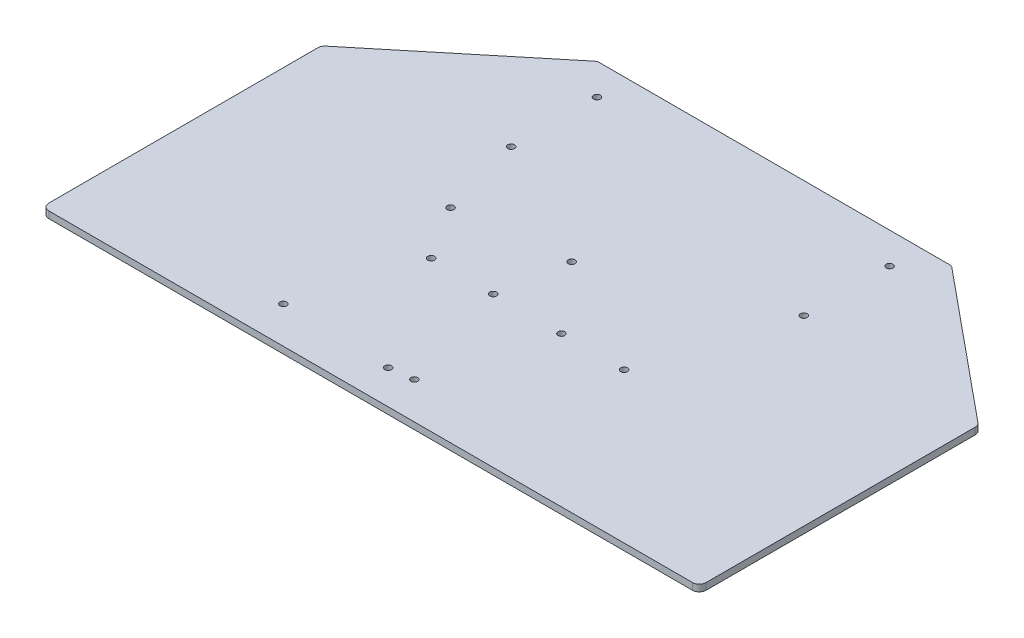
ISO-10303-21;
HEADER;
FILE_DESCRIPTION(('STEP AP214'),'2;1');
FILE_NAME('part.step','',(''),(''),'','','');
FILE_SCHEMA(('AUTOMOTIVE_DESIGN { 1 0 10303 214 1 1 1 1 }'));
ENDSEC;
DATA;
#1=APPLICATION_CONTEXT('core data for automotive mechanical design processes');
#2=APPLICATION_PROTOCOL_DEFINITION('international standard','automotive_design',2000,#1);
#3=PRODUCT_CONTEXT('',#1,'mechanical');
#4=PRODUCT('Part','Part','',(#3));
#5=PRODUCT_RELATED_PRODUCT_CATEGORY('part','',(#4));
#6=PRODUCT_DEFINITION_FORMATION('','',#4);
#7=PRODUCT_DEFINITION_CONTEXT('part definition',#1,'design');
#8=PRODUCT_DEFINITION('design','',#6,#7);
#9=PRODUCT_DEFINITION_SHAPE('','',#8);
#10=(LENGTH_UNIT() NAMED_UNIT(*) SI_UNIT(.MILLI.,.METRE.));
#11=(NAMED_UNIT(*) PLANE_ANGLE_UNIT() SI_UNIT($,.RADIAN.));
#12=(NAMED_UNIT(*) SI_UNIT($,.STERADIAN.) SOLID_ANGLE_UNIT());
#13=UNCERTAINTY_MEASURE_WITH_UNIT(LENGTH_MEASURE(1.E-05),#10,'distance_accuracy_value','');
#14=(GEOMETRIC_REPRESENTATION_CONTEXT(3) GLOBAL_UNCERTAINTY_ASSIGNED_CONTEXT((#13)) GLOBAL_UNIT_ASSIGNED_CONTEXT((#10,
#11,#12)) REPRESENTATION_CONTEXT('',''));
#15=CARTESIAN_POINT('',(0.,0.,0.));
#16=DIRECTION('',(0.,0.,1.));
#17=DIRECTION('',(1.,0.,0.));
#18=AXIS2_PLACEMENT_3D('',#15,#16,#17);
#19=CARTESIAN_POINT('',(0.,3.,0.));
#20=DIRECTION('',(0.,-1.,0.));
#21=DIRECTION('',(0.,0.,-1.));
#22=AXIS2_PLACEMENT_3D('',#19,#20,#21);
#23=PLANE('',#22);
#24=CARTESIAN_POINT('',(151.6,3.,-18.4000000000124));
#25=DIRECTION('',(0.,1.,0.));
#26=DIRECTION('',(0.,0.,1.));
#27=AXIS2_PLACEMENT_3D('',#24,#25,#26);
#28=CIRCLE('',#27,1.49999999999638);
#29=CARTESIAN_POINT('',(151.6,3.,-16.900000000016));
#30=VERTEX_POINT('',#29);
#31=EDGE_CURVE('E247',#30,#30,#28,.T.);
#32=ORIENTED_EDGE('',*,*,#31,.F.);
#33=EDGE_LOOP('',(#32));
#34=FACE_BOUND('',#33,.T.);
#35=CARTESIAN_POINT('',(194.6,3.,-68.9000000000124));
#36=DIRECTION('',(0.,1.,0.));
#37=DIRECTION('',(0.,0.,1.));
#38=AXIS2_PLACEMENT_3D('',#35,#36,#37);
#39=CIRCLE('',#38,1.49999999999637);
#40=CARTESIAN_POINT('',(194.6,3.,-67.400000000016));
#41=VERTEX_POINT('',#40);
#42=EDGE_CURVE('E253',#41,#41,#39,.T.);
#43=ORIENTED_EDGE('',*,*,#42,.F.);
#44=EDGE_LOOP('',(#43));
#45=FACE_BOUND('',#44,.T.);
#46=CARTESIAN_POINT('',(83.275,3.,-129.849046066715));
#47=DIRECTION('',(0.,1.,0.));
#48=DIRECTION('',(0.,0.,1.));
#49=AXIS2_PLACEMENT_3D('',#46,#47,#48);
#50=CIRCLE('',#49,1.5);
#51=CARTESIAN_POINT('',(83.275,3.,-128.349046066715));
#52=VERTEX_POINT('',#51);
#53=EDGE_CURVE('E234',#52,#52,#50,.T.);
#54=ORIENTED_EDGE('',*,*,#53,.F.);
#55=EDGE_LOOP('',(#54));
#56=FACE_BOUND('',#55,.T.);
#57=CARTESIAN_POINT('',(213.725,3.,-168.099046066715));
#58=DIRECTION('',(0.,1.,0.));
#59=DIRECTION('',(0.,0.,1.));
#60=AXIS2_PLACEMENT_3D('',#57,#58,#59);
#61=CIRCLE('',#60,1.5);
#62=CARTESIAN_POINT('',(213.725,3.,-166.599046066715));
#63=VERTEX_POINT('',#62);
#64=EDGE_CURVE('E207',#63,#63,#61,.T.);
#65=ORIENTED_EDGE('',*,*,#64,.F.);
#66=EDGE_LOOP('',(#65));
#67=FACE_BOUND('',#66,.T.);
#68=CARTESIAN_POINT('',(93.2999999999997,3.,-92.8000000000124));
#69=DIRECTION('',(0.,1.,0.));
#70=DIRECTION('',(0.,0.,1.));
#71=AXIS2_PLACEMENT_3D('',#68,#69,#70);
#72=CIRCLE('',#71,1.49999999999637);
#73=CARTESIAN_POINT('',(93.2999999999997,3.,-91.300000000016));
#74=VERTEX_POINT('',#73);
#75=EDGE_CURVE('E40',#74,#74,#72,.T.);
#76=ORIENTED_EDGE('',*,*,#75,.F.);
#77=EDGE_LOOP('',(#76));
#78=FACE_BOUND('',#77,.T.);
#79=CARTESIAN_POINT('',(141.2,3.,-17.1000000000124));
#80=DIRECTION('',(0.,1.,0.));
#81=DIRECTION('',(0.,0.,1.));
#82=AXIS2_PLACEMENT_3D('',#79,#80,#81);
#83=CIRCLE('',#82,1.49999999999638);
#84=CARTESIAN_POINT('',(141.2,3.,-15.600000000016));
#85=VERTEX_POINT('',#84);
#86=EDGE_CURVE('E264',#85,#85,#83,.T.);
#87=ORIENTED_EDGE('',*,*,#86,.F.);
#88=EDGE_LOOP('',(#87));
#89=FACE_BOUND('',#88,.T.);
#90=CARTESIAN_POINT('',(93.1999999999997,3.,-18.3500000000124));
#91=DIRECTION('',(0.,1.,0.));
#92=DIRECTION('',(0.,0.,1.));
#93=AXIS2_PLACEMENT_3D('',#90,#91,#92);
#94=CIRCLE('',#93,1.49999999999638);
#95=CARTESIAN_POINT('',(93.1999999999997,3.,-16.850000000016));
#96=VERTEX_POINT('',#95);
#97=EDGE_CURVE('E265',#96,#96,#94,.T.);
#98=ORIENTED_EDGE('',*,*,#97,.F.);
#99=EDGE_LOOP('',(#98));
#100=FACE_BOUND('',#99,.T.);
#101=CARTESIAN_POINT('',(166.65,3.,-68.9000000000124));
#102=DIRECTION('',(0.,1.,0.));
#103=DIRECTION('',(0.,0.,1.));
#104=AXIS2_PLACEMENT_3D('',#101,#102,#103);
#105=CIRCLE('',#104,1.49999999999637);
#106=CARTESIAN_POINT('',(166.65,3.,-67.400000000016));
#107=VERTEX_POINT('',#106);
#108=EDGE_CURVE('E246',#107,#107,#105,.T.);
#109=ORIENTED_EDGE('',*,*,#108,.F.);
#110=EDGE_LOOP('',(#109));
#111=FACE_BOUND('',#110,.T.);
#112=CARTESIAN_POINT('',(108.5,3.,-68.9500000000124));
#113=DIRECTION('',(0.,1.,0.));
#114=DIRECTION('',(0.,0.,1.));
#115=AXIS2_PLACEMENT_3D('',#112,#113,#114);
#116=CIRCLE('',#115,1.49999999999637);
#117=CARTESIAN_POINT('',(108.5,3.,-67.450000000016));
#118=VERTEX_POINT('',#117);
#119=EDGE_CURVE('E276',#118,#118,#116,.T.);
#120=ORIENTED_EDGE('',*,*,#119,.F.);
#121=EDGE_LOOP('',(#120));
#122=FACE_BOUND('',#121,.T.);
#123=CARTESIAN_POINT('',(136.2,3.,-68.9500000000124));
#124=DIRECTION('',(0.,1.,0.));
#125=DIRECTION('',(0.,0.,1.));
#126=AXIS2_PLACEMENT_3D('',#123,#124,#125);
#127=CIRCLE('',#126,1.49999999999637);
#128=CARTESIAN_POINT('',(136.2,3.,-67.450000000016));
#129=VERTEX_POINT('',#128);
#130=EDGE_CURVE('E288',#129,#129,#127,.T.);
#131=ORIENTED_EDGE('',*,*,#130,.F.);
#132=EDGE_LOOP('',(#131));
#133=FACE_BOUND('',#132,.T.);
#134=CARTESIAN_POINT('',(141.2,3.,-98.9000000000124));
#135=DIRECTION('',(0.,1.,0.));
#136=DIRECTION('',(0.,0.,1.));
#137=AXIS2_PLACEMENT_3D('',#134,#135,#136);
#138=CIRCLE('',#137,1.49999999999637);
#139=CARTESIAN_POINT('',(141.2,3.,-97.400000000016));
#140=VERTEX_POINT('',#139);
#141=EDGE_CURVE('E282',#140,#140,#138,.T.);
#142=ORIENTED_EDGE('',*,*,#141,.F.);
#143=EDGE_LOOP('',(#142));
#144=FACE_BOUND('',#143,.T.);
#145=CARTESIAN_POINT('',(213.725,3.,-129.849046066715));
#146=DIRECTION('',(0.,1.,0.));
#147=DIRECTION('',(0.,0.,1.));
#148=AXIS2_PLACEMENT_3D('',#145,#146,#147);
#149=CIRCLE('',#148,1.5);
#150=CARTESIAN_POINT('',(213.725,3.,-128.349046066715));
#151=VERTEX_POINT('',#150);
#152=EDGE_CURVE('E235',#151,#151,#149,.T.);
#153=ORIENTED_EDGE('',*,*,#152,.F.);
#154=EDGE_LOOP('',(#153));
#155=FACE_BOUND('',#154,.T.);
#156=CARTESIAN_POINT('',(83.275,3.,-168.099046066715));
#157=DIRECTION('',(0.,1.,0.));
#158=DIRECTION('',(0.,0.,1.));
#159=AXIS2_PLACEMENT_3D('',#156,#157,#158);
#160=CIRCLE('',#159,1.5);
#161=CARTESIAN_POINT('',(83.275,3.,-166.599046066715));
#162=VERTEX_POINT('',#161);
#163=EDGE_CURVE('E228',#162,#162,#160,.T.);
#164=ORIENTED_EDGE('',*,*,#163,.F.);
#165=EDGE_LOOP('',(#164));
#166=FACE_BOUND('',#165,.T.);
#167=CARTESIAN_POINT('',(5.,3.,-5.));
#168=DIRECTION('',(0.,1.,0.));
#169=DIRECTION('',(0.,0.,1.));
#170=AXIS2_PLACEMENT_3D('',#167,#168,#169);
#171=CIRCLE('',#170,3.);
#172=CARTESIAN_POINT('',(2.,3.,-5.));
#173=VERTEX_POINT('',#172);
#174=CARTESIAN_POINT('',(5.,3.,-2.));
#175=VERTEX_POINT('',#174);
#176=EDGE_CURVE('E173',#173,#175,#171,.T.);
#177=ORIENTED_EDGE('',*,*,#176,.T.);
#178=DIRECTION('',(1.,0.,0.));
#179=VECTOR('',#178,1.);
#180=CARTESIAN_POINT('',(5.,3.,-2.));
#181=LINE('',#180,#179);
#182=CARTESIAN_POINT('',(292.,3.,-2.));
#183=VERTEX_POINT('',#182);
#184=EDGE_CURVE('E176',#175,#183,#181,.T.);
#185=ORIENTED_EDGE('',*,*,#184,.T.);
#186=CARTESIAN_POINT('',(292.,3.,-5.));
#187=DIRECTION('',(0.,1.,0.));
#188=DIRECTION('',(0.,0.,1.));
#189=AXIS2_PLACEMENT_3D('',#186,#187,#188);
#190=CIRCLE('',#189,2.99999999999997);
#191=CARTESIAN_POINT('',(295.,3.,-5.));
#192=VERTEX_POINT('',#191);
#193=EDGE_CURVE('E51',#183,#192,#190,.T.);
#194=ORIENTED_EDGE('',*,*,#193,.T.);
#195=DIRECTION('',(0.,0.,-1.));
#196=VECTOR('',#195,1.);
#197=CARTESIAN_POINT('',(295.,3.,-5.));
#198=LINE('',#197,#196);
#199=CARTESIAN_POINT('',(295.,3.,-125.));
#200=VERTEX_POINT('',#199);
#201=EDGE_CURVE('E132',#192,#200,#198,.T.);
#202=ORIENTED_EDGE('',*,*,#201,.T.);
#203=CARTESIAN_POINT('',(292.,3.,-125.));
#204=DIRECTION('',(0.,1.,0.));
#205=DIRECTION('',(0.,0.,-1.));
#206=AXIS2_PLACEMENT_3D('',#203,#204,#205);
#207=CIRCLE('',#206,3.);
#208=CARTESIAN_POINT('',(293.906404455119,3.,-127.316381240966));
#209=VERTEX_POINT('',#208);
#210=EDGE_CURVE('E181',#200,#209,#207,.T.);
#211=ORIENTED_EDGE('',*,*,#210,.T.);
#212=DIRECTION('',(-0.772127080322098,0.,-0.635468151706497));
#213=VECTOR('',#212,1.);
#214=CARTESIAN_POINT('',(293.906404455119,3.,-127.316381240966));
#215=LINE('',#214,#213);
#216=CARTESIAN_POINT('',(228.293576769853,3.,-181.316381240966));
#217=VERTEX_POINT('',#216);
#218=EDGE_CURVE('E184',#209,#217,#215,.T.);
#219=ORIENTED_EDGE('',*,*,#218,.T.);
#220=CARTESIAN_POINT('',(226.387172314733,3.,-179.));
#221=DIRECTION('',(0.,1.,0.));
#222=DIRECTION('',(0.,0.,-1.));
#223=AXIS2_PLACEMENT_3D('',#220,#221,#222);
#224=CIRCLE('',#223,3.00000000000001);
#225=CARTESIAN_POINT('',(226.387172314733,3.,-182.));
#226=VERTEX_POINT('',#225);
#227=EDGE_CURVE('E187',#217,#226,#224,.T.);
#228=ORIENTED_EDGE('',*,*,#227,.T.);
#229=DIRECTION('',(-1.,0.,0.));
#230=VECTOR('',#229,1.);
#231=CARTESIAN_POINT('',(70.6128276852667,3.,-182.));
#232=LINE('',#231,#230);
#233=CARTESIAN_POINT('',(70.6128276852667,3.,-182.));
#234=VERTEX_POINT('',#233);
#235=EDGE_CURVE('E190',#226,#234,#232,.T.);
#236=ORIENTED_EDGE('',*,*,#235,.T.);
#237=CARTESIAN_POINT('',(70.6128276852667,3.,-179.));
#238=DIRECTION('',(0.,1.,0.));
#239=DIRECTION('',(0.,0.,1.));
#240=AXIS2_PLACEMENT_3D('',#237,#238,#239);
#241=CIRCLE('',#240,3.00000000000001);
#242=CARTESIAN_POINT('',(68.7064232301472,3.,-181.316381240966));
#243=VERTEX_POINT('',#242);
#244=EDGE_CURVE('E193',#234,#243,#241,.T.);
#245=ORIENTED_EDGE('',*,*,#244,.T.);
#246=DIRECTION('',(-0.772127080322098,0.,0.635468151706497));
#247=VECTOR('',#246,1.);
#248=CARTESIAN_POINT('',(3.0935955448805,3.,-127.316381240966));
#249=LINE('',#248,#247);
#250=CARTESIAN_POINT('',(3.0935955448805,3.,-127.316381240966));
#251=VERTEX_POINT('',#250);
#252=EDGE_CURVE('E196',#243,#251,#249,.T.);
#253=ORIENTED_EDGE('',*,*,#252,.T.);
#254=CARTESIAN_POINT('',(5.,3.,-125.));
#255=DIRECTION('',(0.,1.,0.));
#256=DIRECTION('',(0.,0.,1.));
#257=AXIS2_PLACEMENT_3D('',#254,#255,#256);
#258=CIRCLE('',#257,3.00000000000001);
#259=CARTESIAN_POINT('',(1.99999999999999,3.,-125.));
#260=VERTEX_POINT('',#259);
#261=EDGE_CURVE('E199',#251,#260,#258,.T.);
#262=ORIENTED_EDGE('',*,*,#261,.T.);
#263=DIRECTION('',(0.,0.,1.));
#264=VECTOR('',#263,1.);
#265=CARTESIAN_POINT('',(2.,3.,-5.));
#266=LINE('',#265,#264);
#267=EDGE_CURVE('E202',#260,#173,#266,.T.);
#268=ORIENTED_EDGE('',*,*,#267,.T.);
#269=EDGE_LOOP('',(#177,#185,#194,#202,#211,#219,#228,#236,#245,#253,#262,#268));
#270=FACE_BOUND('',#269,.T.);
#271=ADVANCED_FACE('F36',(#34,#45,#56,#67,#78,#89,#100,#111,#122,#133,#144,#155,#166,#270),#23,.F.);
#272=CARTESIAN_POINT('',(0.,0.,0.));
#273=DIRECTION('',(0.,-1.,0.));
#274=DIRECTION('',(0.,0.,-1.));
#275=AXIS2_PLACEMENT_3D('',#272,#273,#274);
#276=PLANE('',#275);
#277=CARTESIAN_POINT('',(151.6,0.,-18.4000000000124));
#278=DIRECTION('',(0.,1.,0.));
#279=DIRECTION('',(0.,0.,1.));
#280=AXIS2_PLACEMENT_3D('',#277,#278,#279);
#281=CIRCLE('',#280,1.49999999999638);
#282=CARTESIAN_POINT('',(151.6,0.,-16.900000000016));
#283=VERTEX_POINT('',#282);
#284=EDGE_CURVE('E243',#283,#283,#281,.T.);
#285=ORIENTED_EDGE('',*,*,#284,.T.);
#286=EDGE_LOOP('',(#285));
#287=FACE_BOUND('',#286,.T.);
#288=CARTESIAN_POINT('',(194.6,0.,-68.9000000000124));
#289=DIRECTION('',(0.,1.,0.));
#290=DIRECTION('',(0.,0.,1.));
#291=AXIS2_PLACEMENT_3D('',#288,#289,#290);
#292=CIRCLE('',#291,1.49999999999637);
#293=CARTESIAN_POINT('',(194.6,0.,-67.400000000016));
#294=VERTEX_POINT('',#293);
#295=EDGE_CURVE('E250',#294,#294,#292,.T.);
#296=ORIENTED_EDGE('',*,*,#295,.T.);
#297=EDGE_LOOP('',(#296));
#298=FACE_BOUND('',#297,.T.);
#299=CARTESIAN_POINT('',(83.275,0.,-129.849046066715));
#300=DIRECTION('',(0.,1.,0.));
#301=DIRECTION('',(0.,0.,1.));
#302=AXIS2_PLACEMENT_3D('',#299,#300,#301);
#303=CIRCLE('',#302,1.5);
#304=CARTESIAN_POINT('',(83.275,0.,-128.349046066715));
#305=VERTEX_POINT('',#304);
#306=EDGE_CURVE('E256',#305,#305,#303,.T.);
#307=ORIENTED_EDGE('',*,*,#306,.T.);
#308=EDGE_LOOP('',(#307));
#309=FACE_BOUND('',#308,.T.);
#310=CARTESIAN_POINT('',(213.725,0.,-168.099046066715));
#311=DIRECTION('',(0.,1.,0.));
#312=DIRECTION('',(0.,0.,1.));
#313=AXIS2_PLACEMENT_3D('',#310,#311,#312);
#314=CIRCLE('',#313,1.5);
#315=CARTESIAN_POINT('',(213.725,0.,-166.599046066715));
#316=VERTEX_POINT('',#315);
#317=EDGE_CURVE('E225',#316,#316,#314,.T.);
#318=ORIENTED_EDGE('',*,*,#317,.T.);
#319=EDGE_LOOP('',(#318));
#320=FACE_BOUND('',#319,.T.);
#321=CARTESIAN_POINT('',(93.2999999999997,0.,-92.8000000000124));
#322=DIRECTION('',(0.,1.,0.));
#323=DIRECTION('',(0.,0.,1.));
#324=AXIS2_PLACEMENT_3D('',#321,#322,#323);
#325=CIRCLE('',#324,1.49999999999637);
#326=CARTESIAN_POINT('',(93.2999999999997,0.,-91.300000000016));
#327=VERTEX_POINT('',#326);
#328=EDGE_CURVE('E12',#327,#327,#325,.T.);
#329=ORIENTED_EDGE('',*,*,#328,.T.);
#330=EDGE_LOOP('',(#329));
#331=FACE_BOUND('',#330,.T.);
#332=CARTESIAN_POINT('',(141.2,0.,-17.1000000000124));
#333=DIRECTION('',(0.,1.,0.));
#334=DIRECTION('',(0.,0.,1.));
#335=AXIS2_PLACEMENT_3D('',#332,#333,#334);
#336=CIRCLE('',#335,1.49999999999638);
#337=CARTESIAN_POINT('',(141.2,0.,-15.600000000016));
#338=VERTEX_POINT('',#337);
#339=EDGE_CURVE('E273',#338,#338,#336,.T.);
#340=ORIENTED_EDGE('',*,*,#339,.T.);
#341=EDGE_LOOP('',(#340));
#342=FACE_BOUND('',#341,.T.);
#343=CARTESIAN_POINT('',(93.1999999999997,0.,-18.3500000000124));
#344=DIRECTION('',(0.,1.,0.));
#345=DIRECTION('',(0.,0.,1.));
#346=AXIS2_PLACEMENT_3D('',#343,#344,#345);
#347=CIRCLE('',#346,1.49999999999638);
#348=CARTESIAN_POINT('',(93.1999999999997,0.,-16.850000000016));
#349=VERTEX_POINT('',#348);
#350=EDGE_CURVE('E261',#349,#349,#347,.T.);
#351=ORIENTED_EDGE('',*,*,#350,.T.);
#352=EDGE_LOOP('',(#351));
#353=FACE_BOUND('',#352,.T.);
#354=CARTESIAN_POINT('',(166.65,0.,-68.9000000000124));
#355=DIRECTION('',(0.,1.,0.));
#356=DIRECTION('',(0.,0.,1.));
#357=AXIS2_PLACEMENT_3D('',#354,#355,#356);
#358=CIRCLE('',#357,1.49999999999637);
#359=CARTESIAN_POINT('',(166.65,0.,-67.400000000016));
#360=VERTEX_POINT('',#359);
#361=EDGE_CURVE('E268',#360,#360,#358,.T.);
#362=ORIENTED_EDGE('',*,*,#361,.T.);
#363=EDGE_LOOP('',(#362));
#364=FACE_BOUND('',#363,.T.);
#365=CARTESIAN_POINT('',(108.5,0.,-68.9500000000124));
#366=DIRECTION('',(0.,1.,0.));
#367=DIRECTION('',(0.,0.,1.));
#368=AXIS2_PLACEMENT_3D('',#365,#366,#367);
#369=CIRCLE('',#368,1.49999999999637);
#370=CARTESIAN_POINT('',(108.5,0.,-67.450000000016));
#371=VERTEX_POINT('',#370);
#372=EDGE_CURVE('E291',#371,#371,#369,.T.);
#373=ORIENTED_EDGE('',*,*,#372,.T.);
#374=EDGE_LOOP('',(#373));
#375=FACE_BOUND('',#374,.T.);
#376=CARTESIAN_POINT('',(136.2,0.,-68.9500000000124));
#377=DIRECTION('',(0.,1.,0.));
#378=DIRECTION('',(0.,0.,1.));
#379=AXIS2_PLACEMENT_3D('',#376,#377,#378);
#380=CIRCLE('',#379,1.49999999999637);
#381=CARTESIAN_POINT('',(136.2,0.,-67.450000000016));
#382=VERTEX_POINT('',#381);
#383=EDGE_CURVE('E285',#382,#382,#380,.T.);
#384=ORIENTED_EDGE('',*,*,#383,.T.);
#385=EDGE_LOOP('',(#384));
#386=FACE_BOUND('',#385,.T.);
#387=CARTESIAN_POINT('',(141.2,0.,-98.9000000000124));
#388=DIRECTION('',(0.,1.,0.));
#389=DIRECTION('',(0.,0.,1.));
#390=AXIS2_PLACEMENT_3D('',#387,#388,#389);
#391=CIRCLE('',#390,1.49999999999637);
#392=CARTESIAN_POINT('',(141.2,0.,-97.400000000016));
#393=VERTEX_POINT('',#392);
#394=EDGE_CURVE('E279',#393,#393,#391,.T.);
#395=ORIENTED_EDGE('',*,*,#394,.T.);
#396=EDGE_LOOP('',(#395));
#397=FACE_BOUND('',#396,.T.);
#398=CARTESIAN_POINT('',(213.725,0.,-129.849046066715));
#399=DIRECTION('',(0.,1.,0.));
#400=DIRECTION('',(0.,0.,1.));
#401=AXIS2_PLACEMENT_3D('',#398,#399,#400);
#402=CIRCLE('',#401,1.5);
#403=CARTESIAN_POINT('',(213.725,0.,-128.349046066715));
#404=VERTEX_POINT('',#403);
#405=EDGE_CURVE('E231',#404,#404,#402,.T.);
#406=ORIENTED_EDGE('',*,*,#405,.T.);
#407=EDGE_LOOP('',(#406));
#408=FACE_BOUND('',#407,.T.);
#409=CARTESIAN_POINT('',(83.275,0.,-168.099046066715));
#410=DIRECTION('',(0.,1.,0.));
#411=DIRECTION('',(0.,0.,1.));
#412=AXIS2_PLACEMENT_3D('',#409,#410,#411);
#413=CIRCLE('',#412,1.5);
#414=CARTESIAN_POINT('',(83.275,0.,-166.599046066715));
#415=VERTEX_POINT('',#414);
#416=EDGE_CURVE('E238',#415,#415,#413,.T.);
#417=ORIENTED_EDGE('',*,*,#416,.T.);
#418=EDGE_LOOP('',(#417));
#419=FACE_BOUND('',#418,.T.);
#420=DIRECTION('',(1.,0.,0.));
#421=VECTOR('',#420,1.);
#422=CARTESIAN_POINT('',(5.,0.,-2.));
#423=LINE('',#422,#421);
#424=CARTESIAN_POINT('',(5.,0.,-2.));
#425=VERTEX_POINT('',#424);
#426=CARTESIAN_POINT('',(292.,0.,-2.));
#427=VERTEX_POINT('',#426);
#428=EDGE_CURVE('E142',#425,#427,#423,.T.);
#429=ORIENTED_EDGE('',*,*,#428,.F.);
#430=CARTESIAN_POINT('',(5.,0.,-5.));
#431=DIRECTION('',(0.,1.,0.));
#432=DIRECTION('',(0.,0.,1.));
#433=AXIS2_PLACEMENT_3D('',#430,#431,#432);
#434=CIRCLE('',#433,3.);
#435=CARTESIAN_POINT('',(2.,0.,-5.));
#436=VERTEX_POINT('',#435);
#437=EDGE_CURVE('E59',#436,#425,#434,.T.);
#438=ORIENTED_EDGE('',*,*,#437,.F.);
#439=DIRECTION('',(0.,0.,1.));
#440=VECTOR('',#439,1.);
#441=CARTESIAN_POINT('',(2.,0.,-5.));
#442=LINE('',#441,#440);
#443=CARTESIAN_POINT('',(1.99999999999999,0.,-125.));
#444=VERTEX_POINT('',#443);
#445=EDGE_CURVE('E169',#444,#436,#442,.T.);
#446=ORIENTED_EDGE('',*,*,#445,.F.);
#447=CARTESIAN_POINT('',(5.,0.,-125.));
#448=DIRECTION('',(0.,1.,0.));
#449=DIRECTION('',(0.,0.,1.));
#450=AXIS2_PLACEMENT_3D('',#447,#448,#449);
#451=CIRCLE('',#450,3.00000000000001);
#452=CARTESIAN_POINT('',(3.0935955448805,0.,-127.316381240966));
#453=VERTEX_POINT('',#452);
#454=EDGE_CURVE('E166',#453,#444,#451,.T.);
#455=ORIENTED_EDGE('',*,*,#454,.F.);
#456=DIRECTION('',(-0.772127080322098,0.,0.635468151706497));
#457=VECTOR('',#456,1.);
#458=CARTESIAN_POINT('',(3.0935955448805,0.,-127.316381240966));
#459=LINE('',#458,#457);
#460=CARTESIAN_POINT('',(68.7064232301472,0.,-181.316381240966));
#461=VERTEX_POINT('',#460);
#462=EDGE_CURVE('E163',#461,#453,#459,.T.);
#463=ORIENTED_EDGE('',*,*,#462,.F.);
#464=CARTESIAN_POINT('',(70.6128276852667,0.,-179.));
#465=DIRECTION('',(0.,1.,0.));
#466=DIRECTION('',(0.,0.,1.));
#467=AXIS2_PLACEMENT_3D('',#464,#465,#466);
#468=CIRCLE('',#467,3.00000000000001);
#469=CARTESIAN_POINT('',(70.6128276852667,0.,-182.));
#470=VERTEX_POINT('',#469);
#471=EDGE_CURVE('E160',#470,#461,#468,.T.);
#472=ORIENTED_EDGE('',*,*,#471,.F.);
#473=DIRECTION('',(-1.,0.,0.));
#474=VECTOR('',#473,1.);
#475=CARTESIAN_POINT('',(70.6128276852667,0.,-182.));
#476=LINE('',#475,#474);
#477=CARTESIAN_POINT('',(226.387172314733,0.,-182.));
#478=VERTEX_POINT('',#477);
#479=EDGE_CURVE('E157',#478,#470,#476,.T.);
#480=ORIENTED_EDGE('',*,*,#479,.F.);
#481=CARTESIAN_POINT('',(226.387172314733,0.,-179.));
#482=DIRECTION('',(0.,1.,0.));
#483=DIRECTION('',(0.,0.,-1.));
#484=AXIS2_PLACEMENT_3D('',#481,#482,#483);
#485=CIRCLE('',#484,3.00000000000001);
#486=CARTESIAN_POINT('',(228.293576769853,0.,-181.316381240966));
#487=VERTEX_POINT('',#486);
#488=EDGE_CURVE('E154',#487,#478,#485,.T.);
#489=ORIENTED_EDGE('',*,*,#488,.F.);
#490=DIRECTION('',(-0.772127080322098,0.,-0.635468151706497));
#491=VECTOR('',#490,1.);
#492=CARTESIAN_POINT('',(293.906404455119,0.,-127.316381240966));
#493=LINE('',#492,#491);
#494=CARTESIAN_POINT('',(293.906404455119,0.,-127.316381240966));
#495=VERTEX_POINT('',#494);
#496=EDGE_CURVE('E148',#495,#487,#493,.T.);
#497=ORIENTED_EDGE('',*,*,#496,.F.);
#498=CARTESIAN_POINT('',(292.,0.,-125.));
#499=DIRECTION('',(0.,1.,0.));
#500=DIRECTION('',(0.,0.,-1.));
#501=AXIS2_PLACEMENT_3D('',#498,#499,#500);
#502=CIRCLE('',#501,3.);
#503=CARTESIAN_POINT('',(295.,0.,-125.));
#504=VERTEX_POINT('',#503);
#505=EDGE_CURVE('E146',#504,#495,#502,.T.);
#506=ORIENTED_EDGE('',*,*,#505,.F.);
#507=DIRECTION('',(0.,0.,-1.));
#508=VECTOR('',#507,1.);
#509=CARTESIAN_POINT('',(295.,0.,-5.));
#510=LINE('',#509,#508);
#511=CARTESIAN_POINT('',(295.,0.,-5.));
#512=VERTEX_POINT('',#511);
#513=EDGE_CURVE('E129',#512,#504,#510,.T.);
#514=ORIENTED_EDGE('',*,*,#513,.F.);
#515=CARTESIAN_POINT('',(292.,0.,-5.));
#516=DIRECTION('',(0.,1.,0.));
#517=DIRECTION('',(0.,0.,1.));
#518=AXIS2_PLACEMENT_3D('',#515,#516,#517);
#519=CIRCLE('',#518,2.99999999999997);
#520=EDGE_CURVE('E137',#427,#512,#519,.T.);
#521=ORIENTED_EDGE('',*,*,#520,.F.);
#522=EDGE_LOOP('',(#429,#438,#446,#455,#463,#472,#480,#489,#497,#506,#514,#521));
#523=FACE_BOUND('',#522,.T.);
#524=ADVANCED_FACE('F38',(#287,#298,#309,#320,#331,#342,#353,#364,#375,#386,#397,#408,#419,
#523),#276,.T.);
#525=CARTESIAN_POINT('',(93.2999999999997,0.,-92.8000000000124));
#526=DIRECTION('',(0.,1.,0.));
#527=DIRECTION('',(0.,0.,1.));
#528=AXIS2_PLACEMENT_3D('',#525,#526,#527);
#529=CYLINDRICAL_SURFACE('',#528,1.49999999999637);
#530=ORIENTED_EDGE('',*,*,#328,.F.);
#531=EDGE_LOOP('',(#530));
#532=FACE_BOUND('',#531,.T.);
#533=ORIENTED_EDGE('',*,*,#75,.T.);
#534=EDGE_LOOP('',(#533));
#535=FACE_BOUND('',#534,.T.);
#536=ADVANCED_FACE('F398',(#532,#535),#529,.F.);
#537=CARTESIAN_POINT('',(141.2,0.,-17.1000000000124));
#538=DIRECTION('',(0.,1.,0.));
#539=DIRECTION('',(0.,0.,1.));
#540=AXIS2_PLACEMENT_3D('',#537,#538,#539);
#541=CYLINDRICAL_SURFACE('',#540,1.49999999999638);
#542=ORIENTED_EDGE('',*,*,#339,.F.);
#543=EDGE_LOOP('',(#542));
#544=FACE_BOUND('',#543,.T.);
#545=ORIENTED_EDGE('',*,*,#86,.T.);
#546=EDGE_LOOP('',(#545));
#547=FACE_BOUND('',#546,.T.);
#548=ADVANCED_FACE('F391',(#544,#547),#541,.F.);
#549=CARTESIAN_POINT('',(93.1999999999997,0.,-18.3500000000124));
#550=DIRECTION('',(0.,1.,0.));
#551=DIRECTION('',(0.,0.,1.));
#552=AXIS2_PLACEMENT_3D('',#549,#550,#551);
#553=CYLINDRICAL_SURFACE('',#552,1.49999999999638);
#554=ORIENTED_EDGE('',*,*,#350,.F.);
#555=EDGE_LOOP('',(#554));
#556=FACE_BOUND('',#555,.T.);
#557=ORIENTED_EDGE('',*,*,#97,.T.);
#558=EDGE_LOOP('',(#557));
#559=FACE_BOUND('',#558,.T.);
#560=ADVANCED_FACE('F387',(#556,#559),#553,.F.);
#561=CARTESIAN_POINT('',(166.65,0.,-68.9000000000124));
#562=DIRECTION('',(0.,1.,0.));
#563=DIRECTION('',(0.,0.,1.));
#564=AXIS2_PLACEMENT_3D('',#561,#562,#563);
#565=CYLINDRICAL_SURFACE('',#564,1.49999999999637);
#566=ORIENTED_EDGE('',*,*,#361,.F.);
#567=EDGE_LOOP('',(#566));
#568=FACE_BOUND('',#567,.T.);
#569=ORIENTED_EDGE('',*,*,#108,.T.);
#570=EDGE_LOOP('',(#569));
#571=FACE_BOUND('',#570,.T.);
#572=ADVANCED_FACE('F390',(#568,#571),#565,.F.);
#573=CARTESIAN_POINT('',(108.5,0.,-68.9500000000124));
#574=DIRECTION('',(0.,1.,0.));
#575=DIRECTION('',(0.,0.,1.));
#576=AXIS2_PLACEMENT_3D('',#573,#574,#575);
#577=CYLINDRICAL_SURFACE('',#576,1.49999999999637);
#578=ORIENTED_EDGE('',*,*,#372,.F.);
#579=EDGE_LOOP('',(#578));
#580=FACE_BOUND('',#579,.T.);
#581=ORIENTED_EDGE('',*,*,#119,.T.);
#582=EDGE_LOOP('',(#581));
#583=FACE_BOUND('',#582,.T.);
#584=ADVANCED_FACE('F297',(#580,#583),#577,.F.);
#585=CARTESIAN_POINT('',(136.2,0.,-68.9500000000124));
#586=DIRECTION('',(0.,1.,0.));
#587=DIRECTION('',(0.,0.,1.));
#588=AXIS2_PLACEMENT_3D('',#585,#586,#587);
#589=CYLINDRICAL_SURFACE('',#588,1.49999999999637);
#590=ORIENTED_EDGE('',*,*,#383,.F.);
#591=EDGE_LOOP('',(#590));
#592=FACE_BOUND('',#591,.T.);
#593=ORIENTED_EDGE('',*,*,#130,.T.);
#594=EDGE_LOOP('',(#593));
#595=FACE_BOUND('',#594,.T.);
#596=ADVANCED_FACE('F402',(#592,#595),#589,.F.);
#597=CARTESIAN_POINT('',(141.2,0.,-98.9000000000124));
#598=DIRECTION('',(0.,1.,0.));
#599=DIRECTION('',(0.,0.,1.));
#600=AXIS2_PLACEMENT_3D('',#597,#598,#599);
#601=CYLINDRICAL_SURFACE('',#600,1.49999999999637);
#602=ORIENTED_EDGE('',*,*,#394,.F.);
#603=EDGE_LOOP('',(#602));
#604=FACE_BOUND('',#603,.T.);
#605=ORIENTED_EDGE('',*,*,#141,.T.);
#606=EDGE_LOOP('',(#605));
#607=FACE_BOUND('',#606,.T.);
#608=ADVANCED_FACE('F371',(#604,#607),#601,.F.);
#609=CARTESIAN_POINT('',(213.725,0.,-129.849046066715));
#610=DIRECTION('',(0.,1.,0.));
#611=DIRECTION('',(0.,0.,1.));
#612=AXIS2_PLACEMENT_3D('',#609,#610,#611);
#613=CYLINDRICAL_SURFACE('',#612,1.5);
#614=ORIENTED_EDGE('',*,*,#405,.F.);
#615=EDGE_LOOP('',(#614));
#616=FACE_BOUND('',#615,.T.);
#617=ORIENTED_EDGE('',*,*,#152,.T.);
#618=EDGE_LOOP('',(#617));
#619=FACE_BOUND('',#618,.T.);
#620=ADVANCED_FACE('F368',(#616,#619),#613,.F.);
#621=CARTESIAN_POINT('',(83.275,0.,-168.099046066715));
#622=DIRECTION('',(0.,1.,0.));
#623=DIRECTION('',(0.,0.,1.));
#624=AXIS2_PLACEMENT_3D('',#621,#622,#623);
#625=CYLINDRICAL_SURFACE('',#624,1.5);
#626=ORIENTED_EDGE('',*,*,#416,.F.);
#627=EDGE_LOOP('',(#626));
#628=FACE_BOUND('',#627,.T.);
#629=ORIENTED_EDGE('',*,*,#163,.T.);
#630=EDGE_LOOP('',(#629));
#631=FACE_BOUND('',#630,.T.);
#632=ADVANCED_FACE('F363',(#628,#631),#625,.F.);
#633=CARTESIAN_POINT('',(5.,0.,-5.));
#634=DIRECTION('',(0.,1.,0.));
#635=DIRECTION('',(0.,0.,1.));
#636=AXIS2_PLACEMENT_3D('',#633,#634,#635);
#637=CYLINDRICAL_SURFACE('',#636,3.);
#638=ORIENTED_EDGE('',*,*,#176,.F.);
#639=DIRECTION('',(0.,1.,0.));
#640=VECTOR('',#639,1.);
#641=CARTESIAN_POINT('',(2.,0.,-5.));
#642=LINE('',#641,#640);
#643=EDGE_CURVE('E205',#436,#173,#642,.T.);
#644=ORIENTED_EDGE('',*,*,#643,.F.);
#645=ORIENTED_EDGE('',*,*,#437,.T.);
#646=DIRECTION('',(0.,1.,0.));
#647=VECTOR('',#646,1.);
#648=CARTESIAN_POINT('',(5.,0.,-2.));
#649=LINE('',#648,#647);
#650=EDGE_CURVE('E172',#425,#175,#649,.T.);
#651=ORIENTED_EDGE('',*,*,#650,.T.);
#652=EDGE_LOOP('',(#638,#644,#645,#651));
#653=FACE_BOUND('',#652,.T.);
#654=ADVANCED_FACE('F313',(#653),#637,.T.);
#655=CARTESIAN_POINT('',(2.,0.,-5.));
#656=DIRECTION('',(-1.,0.,0.));
#657=DIRECTION('',(0.,0.,1.));
#658=AXIS2_PLACEMENT_3D('',#655,#656,#657);
#659=PLANE('',#658);
#660=ORIENTED_EDGE('',*,*,#267,.F.);
#661=DIRECTION('',(0.,1.,0.));
#662=VECTOR('',#661,1.);
#663=CARTESIAN_POINT('',(1.99999999999999,0.,-125.));
#664=LINE('',#663,#662);
#665=EDGE_CURVE('E208',#444,#260,#664,.T.);
#666=ORIENTED_EDGE('',*,*,#665,.F.);
#667=ORIENTED_EDGE('',*,*,#445,.T.);
#668=ORIENTED_EDGE('',*,*,#643,.T.);
#669=EDGE_LOOP('',(#660,#666,#667,#668));
#670=FACE_BOUND('',#669,.T.);
#671=ADVANCED_FACE('F321',(#670),#659,.T.);
#672=CARTESIAN_POINT('',(5.,0.,-125.));
#673=DIRECTION('',(0.,1.,0.));
#674=DIRECTION('',(0.,0.,1.));
#675=AXIS2_PLACEMENT_3D('',#672,#673,#674);
#676=CYLINDRICAL_SURFACE('',#675,3.00000000000001);
#677=ORIENTED_EDGE('',*,*,#261,.F.);
#678=DIRECTION('',(0.,1.,0.));
#679=VECTOR('',#678,1.);
#680=CARTESIAN_POINT('',(3.0935955448805,0.,-127.316381240966));
#681=LINE('',#680,#679);
#682=EDGE_CURVE('E210',#453,#251,#681,.T.);
#683=ORIENTED_EDGE('',*,*,#682,.F.);
#684=ORIENTED_EDGE('',*,*,#454,.T.);
#685=ORIENTED_EDGE('',*,*,#665,.T.);
#686=EDGE_LOOP('',(#677,#683,#684,#685));
#687=FACE_BOUND('',#686,.T.);
#688=ADVANCED_FACE('F324',(#687),#676,.T.);
#689=CARTESIAN_POINT('',(3.0935955448805,0.,-127.316381240966));
#690=DIRECTION('',(-0.635468151706497,0.,-0.772127080322098));
#691=DIRECTION('',(-0.772127080322098,0.,0.635468151706497));
#692=AXIS2_PLACEMENT_3D('',#689,#690,#691);
#693=PLANE('',#692);
#694=ORIENTED_EDGE('',*,*,#252,.F.);
#695=DIRECTION('',(0.,1.,0.));
#696=VECTOR('',#695,1.);
#697=CARTESIAN_POINT('',(68.7064232301472,0.,-181.316381240966));
#698=LINE('',#697,#696);
#699=EDGE_CURVE('E212',#461,#243,#698,.T.);
#700=ORIENTED_EDGE('',*,*,#699,.F.);
#701=ORIENTED_EDGE('',*,*,#462,.T.);
#702=ORIENTED_EDGE('',*,*,#682,.T.);
#703=EDGE_LOOP('',(#694,#700,#701,#702));
#704=FACE_BOUND('',#703,.T.);
#705=ADVANCED_FACE('F327',(#704),#693,.T.);
#706=CARTESIAN_POINT('',(70.6128276852667,0.,-179.));
#707=DIRECTION('',(0.,1.,0.));
#708=DIRECTION('',(0.,0.,1.));
#709=AXIS2_PLACEMENT_3D('',#706,#707,#708);
#710=CYLINDRICAL_SURFACE('',#709,3.00000000000001);
#711=ORIENTED_EDGE('',*,*,#244,.F.);
#712=DIRECTION('',(0.,1.,0.));
#713=VECTOR('',#712,1.);
#714=CARTESIAN_POINT('',(70.6128276852667,0.,-182.));
#715=LINE('',#714,#713);
#716=EDGE_CURVE('E214',#470,#234,#715,.T.);
#717=ORIENTED_EDGE('',*,*,#716,.F.);
#718=ORIENTED_EDGE('',*,*,#471,.T.);
#719=ORIENTED_EDGE('',*,*,#699,.T.);
#720=EDGE_LOOP('',(#711,#717,#718,#719));
#721=FACE_BOUND('',#720,.T.);
#722=ADVANCED_FACE('F333',(#721),#710,.T.);
#723=CARTESIAN_POINT('',(70.6128276852667,0.,-182.));
#724=DIRECTION('',(0.,0.,-1.));
#725=DIRECTION('',(-1.,0.,0.));
#726=AXIS2_PLACEMENT_3D('',#723,#724,#725);
#727=PLANE('',#726);
#728=ORIENTED_EDGE('',*,*,#235,.F.);
#729=DIRECTION('',(0.,1.,0.));
#730=VECTOR('',#729,1.);
#731=CARTESIAN_POINT('',(226.387172314733,0.,-182.));
#732=LINE('',#731,#730);
#733=EDGE_CURVE('E216',#478,#226,#732,.T.);
#734=ORIENTED_EDGE('',*,*,#733,.F.);
#735=ORIENTED_EDGE('',*,*,#479,.T.);
#736=ORIENTED_EDGE('',*,*,#716,.T.);
#737=EDGE_LOOP('',(#728,#734,#735,#736));
#738=FACE_BOUND('',#737,.T.);
#739=ADVANCED_FACE('F336',(#738),#727,.T.);
#740=CARTESIAN_POINT('',(226.387172314733,0.,-179.));
#741=DIRECTION('',(0.,1.,0.));
#742=DIRECTION('',(0.,0.,1.));
#743=AXIS2_PLACEMENT_3D('',#740,#741,#742);
#744=CYLINDRICAL_SURFACE('',#743,3.00000000000001);
#745=ORIENTED_EDGE('',*,*,#227,.F.);
#746=DIRECTION('',(0.,1.,0.));
#747=VECTOR('',#746,1.);
#748=CARTESIAN_POINT('',(228.293576769853,0.,-181.316381240966));
#749=LINE('',#748,#747);
#750=EDGE_CURVE('E218',#487,#217,#749,.T.);
#751=ORIENTED_EDGE('',*,*,#750,.F.);
#752=ORIENTED_EDGE('',*,*,#488,.T.);
#753=ORIENTED_EDGE('',*,*,#733,.T.);
#754=EDGE_LOOP('',(#745,#751,#752,#753));
#755=FACE_BOUND('',#754,.T.);
#756=ADVANCED_FACE('F339',(#755),#744,.T.);
#757=CARTESIAN_POINT('',(293.906404455119,0.,-127.316381240966));
#758=DIRECTION('',(0.635468151706497,0.,-0.772127080322098));
#759=DIRECTION('',(-0.772127080322098,0.,-0.635468151706498));
#760=AXIS2_PLACEMENT_3D('',#757,#758,#759);
#761=PLANE('',#760);
#762=ORIENTED_EDGE('',*,*,#218,.F.);
#763=DIRECTION('',(0.,1.,0.));
#764=VECTOR('',#763,1.);
#765=CARTESIAN_POINT('',(293.906404455119,0.,-127.316381240966));
#766=LINE('',#765,#764);
#767=EDGE_CURVE('E220',#495,#209,#766,.T.);
#768=ORIENTED_EDGE('',*,*,#767,.F.);
#769=ORIENTED_EDGE('',*,*,#496,.T.);
#770=ORIENTED_EDGE('',*,*,#750,.T.);
#771=EDGE_LOOP('',(#762,#768,#769,#770));
#772=FACE_BOUND('',#771,.T.);
#773=ADVANCED_FACE('F342',(#772),#761,.T.);
#774=CARTESIAN_POINT('',(292.,0.,-125.));
#775=DIRECTION('',(0.,1.,0.));
#776=DIRECTION('',(0.,0.,1.));
#777=AXIS2_PLACEMENT_3D('',#774,#775,#776);
#778=CYLINDRICAL_SURFACE('',#777,3.);
#779=ORIENTED_EDGE('',*,*,#210,.F.);
#780=DIRECTION('',(0.,1.,0.));
#781=VECTOR('',#780,1.);
#782=CARTESIAN_POINT('',(295.,0.,-125.));
#783=LINE('',#782,#781);
#784=EDGE_CURVE('E133',#504,#200,#783,.T.);
#785=ORIENTED_EDGE('',*,*,#784,.F.);
#786=ORIENTED_EDGE('',*,*,#505,.T.);
#787=ORIENTED_EDGE('',*,*,#767,.T.);
#788=EDGE_LOOP('',(#779,#785,#786,#787));
#789=FACE_BOUND('',#788,.T.);
#790=ADVANCED_FACE('F345',(#789),#778,.T.);
#791=CARTESIAN_POINT('',(295.,0.,-5.));
#792=DIRECTION('',(1.,0.,0.));
#793=DIRECTION('',(0.,0.,-1.));
#794=AXIS2_PLACEMENT_3D('',#791,#792,#793);
#795=PLANE('',#794);
#796=ORIENTED_EDGE('',*,*,#201,.F.);
#797=DIRECTION('',(0.,1.,0.));
#798=VECTOR('',#797,1.);
#799=CARTESIAN_POINT('',(295.,0.,-5.));
#800=LINE('',#799,#798);
#801=EDGE_CURVE('E125',#512,#192,#800,.T.);
#802=ORIENTED_EDGE('',*,*,#801,.F.);
#803=ORIENTED_EDGE('',*,*,#513,.T.);
#804=ORIENTED_EDGE('',*,*,#784,.T.);
#805=EDGE_LOOP('',(#796,#802,#803,#804));
#806=FACE_BOUND('',#805,.T.);
#807=ADVANCED_FACE('F127',(#806),#795,.T.);
#808=CARTESIAN_POINT('',(292.,0.,-5.));
#809=DIRECTION('',(0.,1.,0.));
#810=DIRECTION('',(0.,0.,1.));
#811=AXIS2_PLACEMENT_3D('',#808,#809,#810);
#812=CYLINDRICAL_SURFACE('',#811,2.99999999999997);
#813=ORIENTED_EDGE('',*,*,#193,.F.);
#814=DIRECTION('',(0.,1.,0.));
#815=VECTOR('',#814,1.);
#816=CARTESIAN_POINT('',(292.,0.,-2.));
#817=LINE('',#816,#815);
#818=EDGE_CURVE('E134',#427,#183,#817,.T.);
#819=ORIENTED_EDGE('',*,*,#818,.F.);
#820=ORIENTED_EDGE('',*,*,#520,.T.);
#821=ORIENTED_EDGE('',*,*,#801,.T.);
#822=EDGE_LOOP('',(#813,#819,#820,#821));
#823=FACE_BOUND('',#822,.T.);
#824=ADVANCED_FACE('F138',(#823),#812,.T.);
#825=CARTESIAN_POINT('',(5.,0.,-2.));
#826=DIRECTION('',(0.,0.,1.));
#827=DIRECTION('',(1.,0.,0.));
#828=AXIS2_PLACEMENT_3D('',#825,#826,#827);
#829=PLANE('',#828);
#830=ORIENTED_EDGE('',*,*,#184,.F.);
#831=ORIENTED_EDGE('',*,*,#650,.F.);
#832=ORIENTED_EDGE('',*,*,#428,.T.);
#833=ORIENTED_EDGE('',*,*,#818,.T.);
#834=EDGE_LOOP('',(#830,#831,#832,#833));
#835=FACE_BOUND('',#834,.T.);
#836=ADVANCED_FACE('F315',(#835),#829,.T.);
#837=CARTESIAN_POINT('',(213.725,0.,-168.099046066715));
#838=DIRECTION('',(0.,1.,0.));
#839=DIRECTION('',(0.,0.,1.));
#840=AXIS2_PLACEMENT_3D('',#837,#838,#839);
#841=CYLINDRICAL_SURFACE('',#840,1.5);
#842=ORIENTED_EDGE('',*,*,#317,.F.);
#843=EDGE_LOOP('',(#842));
#844=FACE_BOUND('',#843,.T.);
#845=ORIENTED_EDGE('',*,*,#64,.T.);
#846=EDGE_LOOP('',(#845));
#847=FACE_BOUND('',#846,.T.);
#848=ADVANCED_FACE('F360',(#844,#847),#841,.F.);
#849=CARTESIAN_POINT('',(83.275,0.,-129.849046066715));
#850=DIRECTION('',(0.,1.,0.));
#851=DIRECTION('',(0.,0.,1.));
#852=AXIS2_PLACEMENT_3D('',#849,#850,#851);
#853=CYLINDRICAL_SURFACE('',#852,1.5);
#854=ORIENTED_EDGE('',*,*,#306,.F.);
#855=EDGE_LOOP('',(#854));
#856=FACE_BOUND('',#855,.T.);
#857=ORIENTED_EDGE('',*,*,#53,.T.);
#858=EDGE_LOOP('',(#857));
#859=FACE_BOUND('',#858,.T.);
#860=ADVANCED_FACE('F366',(#856,#859),#853,.F.);
#861=CARTESIAN_POINT('',(194.6,0.,-68.9000000000124));
#862=DIRECTION('',(0.,1.,0.));
#863=DIRECTION('',(0.,0.,1.));
#864=AXIS2_PLACEMENT_3D('',#861,#862,#863);
#865=CYLINDRICAL_SURFACE('',#864,1.49999999999637);
#866=ORIENTED_EDGE('',*,*,#295,.F.);
#867=EDGE_LOOP('',(#866));
#868=FACE_BOUND('',#867,.T.);
#869=ORIENTED_EDGE('',*,*,#42,.T.);
#870=EDGE_LOOP('',(#869));
#871=FACE_BOUND('',#870,.T.);
#872=ADVANCED_FACE('F379',(#868,#871),#865,.F.);
#873=CARTESIAN_POINT('',(151.6,0.,-18.4000000000124));
#874=DIRECTION('',(0.,1.,0.));
#875=DIRECTION('',(0.,0.,1.));
#876=AXIS2_PLACEMENT_3D('',#873,#874,#875);
#877=CYLINDRICAL_SURFACE('',#876,1.49999999999638);
#878=ORIENTED_EDGE('',*,*,#284,.F.);
#879=EDGE_LOOP('',(#878));
#880=FACE_BOUND('',#879,.T.);
#881=ORIENTED_EDGE('',*,*,#31,.T.);
#882=EDGE_LOOP('',(#881));
#883=FACE_BOUND('',#882,.T.);
#884=ADVANCED_FACE('F376',(#880,#883),#877,.F.);
#885=CLOSED_SHELL('',(#271,#524,#536,#548,#560,#572,#584,#596,#608,#620,#632,#654,#671,#688,
#705,#722,#739,#756,#773,#790,#807,#824,#836,#848,#860,#872,#884));
#886=MANIFOLD_SOLID_BREP('B2',#885);
#887=ADVANCED_BREP_SHAPE_REPRESENTATION('',(#18,#886),#14);
#888=SHAPE_DEFINITION_REPRESENTATION(#9,#887);
ENDSEC;
END-ISO-10303-21;
